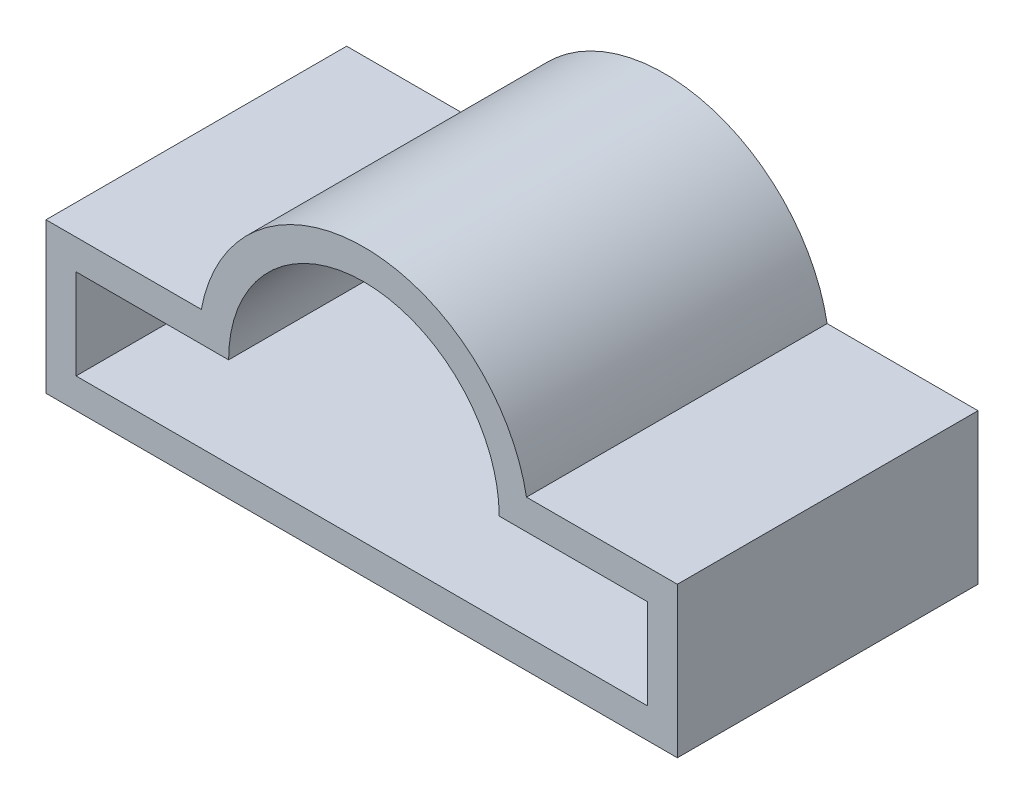
ISO-10303-21;
HEADER;
FILE_DESCRIPTION(('STEP AP214'),'2;1');
FILE_NAME('part.step','',(''),(''),'','','');
FILE_SCHEMA(('AUTOMOTIVE_DESIGN { 1 0 10303 214 1 1 1 1 }'));
ENDSEC;
DATA;
#1=APPLICATION_CONTEXT('core data for automotive mechanical design processes');
#2=APPLICATION_PROTOCOL_DEFINITION('international standard','automotive_design',2000,#1);
#3=PRODUCT_CONTEXT('',#1,'mechanical');
#4=PRODUCT('Part','Part','',(#3));
#5=PRODUCT_RELATED_PRODUCT_CATEGORY('part','',(#4));
#6=PRODUCT_DEFINITION_FORMATION('','',#4);
#7=PRODUCT_DEFINITION_CONTEXT('part definition',#1,'design');
#8=PRODUCT_DEFINITION('design','',#6,#7);
#9=PRODUCT_DEFINITION_SHAPE('','',#8);
#10=(LENGTH_UNIT() NAMED_UNIT(*) SI_UNIT(.MILLI.,.METRE.));
#11=(NAMED_UNIT(*) PLANE_ANGLE_UNIT() SI_UNIT($,.RADIAN.));
#12=(NAMED_UNIT(*) SI_UNIT($,.STERADIAN.) SOLID_ANGLE_UNIT());
#13=UNCERTAINTY_MEASURE_WITH_UNIT(LENGTH_MEASURE(1.E-05),#10,'distance_accuracy_value','');
#14=(GEOMETRIC_REPRESENTATION_CONTEXT(3) GLOBAL_UNCERTAINTY_ASSIGNED_CONTEXT((#13)) GLOBAL_UNIT_ASSIGNED_CONTEXT((#10,
#11,#12)) REPRESENTATION_CONTEXT('',''));
#15=CARTESIAN_POINT('',(0.,0.,0.));
#16=DIRECTION('',(0.,0.,1.));
#17=DIRECTION('',(1.,0.,0.));
#18=AXIS2_PLACEMENT_3D('',#15,#16,#17);
#19=CARTESIAN_POINT('',(0.,0.,10.));
#20=DIRECTION('',(0.,0.,-1.));
#21=DIRECTION('',(-1.,0.,0.));
#22=AXIS2_PLACEMENT_3D('',#19,#20,#21);
#23=PLANE('',#22);
#24=CARTESIAN_POINT('',(0.,0.,10.));
#25=DIRECTION('',(0.,0.,1.));
#26=DIRECTION('',(-1.,0.,0.));
#27=AXIS2_PLACEMENT_3D('',#24,#25,#26);
#28=CIRCLE('',#27,11.);
#29=CARTESIAN_POINT('',(10.816653826392,2.,10.));
#30=VERTEX_POINT('',#29);
#31=CARTESIAN_POINT('',(-10.816653826392,2.,10.));
#32=VERTEX_POINT('',#31);
#33=EDGE_CURVE('E173',#30,#32,#28,.T.);
#34=ORIENTED_EDGE('',*,*,#33,.T.);
#35=DIRECTION('',(-1.,0.,0.));
#36=VECTOR('',#35,1.);
#37=CARTESIAN_POINT('',(-21.1476028804045,2.,10.));
#38=LINE('',#37,#36);
#39=CARTESIAN_POINT('',(-21.1476028804045,2.,10.));
#40=VERTEX_POINT('',#39);
#41=EDGE_CURVE('E176',#32,#40,#38,.T.);
#42=ORIENTED_EDGE('',*,*,#41,.T.);
#43=DIRECTION('',(0.,-1.,0.));
#44=VECTOR('',#43,1.);
#45=CARTESIAN_POINT('',(-21.1476028804045,-8.,10.));
#46=LINE('',#45,#44);
#47=CARTESIAN_POINT('',(-21.1476028804045,-8.,10.));
#48=VERTEX_POINT('',#47);
#49=EDGE_CURVE('E179',#40,#48,#46,.T.);
#50=ORIENTED_EDGE('',*,*,#49,.T.);
#51=DIRECTION('',(1.,0.,0.));
#52=VECTOR('',#51,1.);
#53=CARTESIAN_POINT('',(20.8523971195955,-8.,10.));
#54=LINE('',#53,#52);
#55=CARTESIAN_POINT('',(20.8523971195955,-8.,10.));
#56=VERTEX_POINT('',#55);
#57=EDGE_CURVE('E181',#48,#56,#54,.T.);
#58=ORIENTED_EDGE('',*,*,#57,.T.);
#59=DIRECTION('',(0.,1.,0.));
#60=VECTOR('',#59,1.);
#61=CARTESIAN_POINT('',(20.8523971195955,2.,10.));
#62=LINE('',#61,#60);
#63=CARTESIAN_POINT('',(20.8523971195955,2.,10.));
#64=VERTEX_POINT('',#63);
#65=EDGE_CURVE('E183',#56,#64,#62,.T.);
#66=ORIENTED_EDGE('',*,*,#65,.T.);
#67=DIRECTION('',(-1.,0.,0.));
#68=VECTOR('',#67,1.);
#69=CARTESIAN_POINT('',(10.816653826392,2.,10.));
#70=LINE('',#69,#68);
#71=EDGE_CURVE('E185',#64,#30,#70,.T.);
#72=ORIENTED_EDGE('',*,*,#71,.T.);
#73=EDGE_LOOP('',(#34,#42,#50,#58,#66,#72));
#74=FACE_BOUND('',#73,.T.);
#75=CARTESIAN_POINT('',(0.,0.,10.));
#76=DIRECTION('',(0.,0.,1.));
#77=DIRECTION('',(-1.,0.,0.));
#78=AXIS2_PLACEMENT_3D('',#75,#76,#77);
#79=CIRCLE('',#78,9.);
#80=CARTESIAN_POINT('',(9.,0.,10.));
#81=VERTEX_POINT('',#80);
#82=CARTESIAN_POINT('',(-9.,0.,10.));
#83=VERTEX_POINT('',#82);
#84=EDGE_CURVE('E122',#81,#83,#79,.T.);
#85=ORIENTED_EDGE('',*,*,#84,.F.);
#86=DIRECTION('',(-1.,0.,0.));
#87=VECTOR('',#86,1.);
#88=CARTESIAN_POINT('',(9.,0.,10.));
#89=LINE('',#88,#87);
#90=CARTESIAN_POINT('',(18.8523971195955,0.,10.));
#91=VERTEX_POINT('',#90);
#92=EDGE_CURVE('E151',#91,#81,#89,.T.);
#93=ORIENTED_EDGE('',*,*,#92,.F.);
#94=DIRECTION('',(0.,1.,0.));
#95=VECTOR('',#94,1.);
#96=CARTESIAN_POINT('',(18.8523971195955,0.,10.));
#97=LINE('',#96,#95);
#98=CARTESIAN_POINT('',(18.8523971195955,-6.,10.));
#99=VERTEX_POINT('',#98);
#100=EDGE_CURVE('E149',#99,#91,#97,.T.);
#101=ORIENTED_EDGE('',*,*,#100,.F.);
#102=DIRECTION('',(1.,0.,0.));
#103=VECTOR('',#102,1.);
#104=CARTESIAN_POINT('',(18.8523971195955,-6.,10.));
#105=LINE('',#104,#103);
#106=CARTESIAN_POINT('',(-19.1476028804045,-6.,10.));
#107=VERTEX_POINT('',#106);
#108=EDGE_CURVE('E145',#107,#99,#105,.T.);
#109=ORIENTED_EDGE('',*,*,#108,.F.);
#110=DIRECTION('',(0.,-1.,0.));
#111=VECTOR('',#110,1.);
#112=CARTESIAN_POINT('',(-19.1476028804045,-6.,10.));
#113=LINE('',#112,#111);
#114=CARTESIAN_POINT('',(-19.1476028804045,0.,10.));
#115=VERTEX_POINT('',#114);
#116=EDGE_CURVE('E143',#115,#107,#113,.T.);
#117=ORIENTED_EDGE('',*,*,#116,.F.);
#118=DIRECTION('',(-1.,0.,0.));
#119=VECTOR('',#118,1.);
#120=CARTESIAN_POINT('',(-19.1476028804045,0.,10.));
#121=LINE('',#120,#119);
#122=EDGE_CURVE('E130',#83,#115,#121,.T.);
#123=ORIENTED_EDGE('',*,*,#122,.F.);
#124=EDGE_LOOP('',(#85,#93,#101,#109,#117,#123));
#125=FACE_BOUND('',#124,.T.);
#126=ADVANCED_FACE('F33',(#74,#125),#23,.F.);
#127=CARTESIAN_POINT('',(0.,0.,-10.));
#128=DIRECTION('',(0.,0.,-1.));
#129=DIRECTION('',(-1.,0.,0.));
#130=AXIS2_PLACEMENT_3D('',#127,#128,#129);
#131=PLANE('',#130);
#132=CARTESIAN_POINT('',(0.,0.,-10.));
#133=DIRECTION('',(0.,0.,1.));
#134=DIRECTION('',(-1.,0.,0.));
#135=AXIS2_PLACEMENT_3D('',#132,#133,#134);
#136=CIRCLE('',#135,11.);
#137=CARTESIAN_POINT('',(10.816653826392,2.,-10.));
#138=VERTEX_POINT('',#137);
#139=CARTESIAN_POINT('',(-10.816653826392,2.,-10.));
#140=VERTEX_POINT('',#139);
#141=EDGE_CURVE('E138',#138,#140,#136,.T.);
#142=ORIENTED_EDGE('',*,*,#141,.F.);
#143=DIRECTION('',(-1.,0.,0.));
#144=VECTOR('',#143,1.);
#145=CARTESIAN_POINT('',(10.816653826392,2.,-10.));
#146=LINE('',#145,#144);
#147=CARTESIAN_POINT('',(20.8523971195955,2.,-10.));
#148=VERTEX_POINT('',#147);
#149=EDGE_CURVE('E177',#148,#138,#146,.T.);
#150=ORIENTED_EDGE('',*,*,#149,.F.);
#151=DIRECTION('',(0.,1.,0.));
#152=VECTOR('',#151,1.);
#153=CARTESIAN_POINT('',(20.8523971195955,2.,-10.));
#154=LINE('',#153,#152);
#155=CARTESIAN_POINT('',(20.8523971195955,-8.,-10.));
#156=VERTEX_POINT('',#155);
#157=EDGE_CURVE('E196',#156,#148,#154,.T.);
#158=ORIENTED_EDGE('',*,*,#157,.F.);
#159=DIRECTION('',(1.,0.,0.));
#160=VECTOR('',#159,1.);
#161=CARTESIAN_POINT('',(20.8523971195955,-8.,-10.));
#162=LINE('',#161,#160);
#163=CARTESIAN_POINT('',(-21.1476028804045,-8.,-10.));
#164=VERTEX_POINT('',#163);
#165=EDGE_CURVE('E194',#164,#156,#162,.T.);
#166=ORIENTED_EDGE('',*,*,#165,.F.);
#167=DIRECTION('',(0.,-1.,0.));
#168=VECTOR('',#167,1.);
#169=CARTESIAN_POINT('',(-21.1476028804045,-8.,-10.));
#170=LINE('',#169,#168);
#171=CARTESIAN_POINT('',(-21.1476028804045,2.,-10.));
#172=VERTEX_POINT('',#171);
#173=EDGE_CURVE('E192',#172,#164,#170,.T.);
#174=ORIENTED_EDGE('',*,*,#173,.F.);
#175=DIRECTION('',(-1.,0.,0.));
#176=VECTOR('',#175,1.);
#177=CARTESIAN_POINT('',(-21.1476028804045,2.,-10.));
#178=LINE('',#177,#176);
#179=EDGE_CURVE('E190',#140,#172,#178,.T.);
#180=ORIENTED_EDGE('',*,*,#179,.F.);
#181=EDGE_LOOP('',(#142,#150,#158,#166,#174,#180));
#182=FACE_BOUND('',#181,.T.);
#183=DIRECTION('',(-1.,0.,0.));
#184=VECTOR('',#183,1.);
#185=CARTESIAN_POINT('',(9.,0.,-10.));
#186=LINE('',#185,#184);
#187=CARTESIAN_POINT('',(18.8523971195955,0.,-10.));
#188=VERTEX_POINT('',#187);
#189=CARTESIAN_POINT('',(9.,0.,-10.));
#190=VERTEX_POINT('',#189);
#191=EDGE_CURVE('E131',#188,#190,#186,.T.);
#192=ORIENTED_EDGE('',*,*,#191,.T.);
#193=CARTESIAN_POINT('',(0.,0.,-10.));
#194=DIRECTION('',(0.,0.,1.));
#195=DIRECTION('',(-1.,0.,0.));
#196=AXIS2_PLACEMENT_3D('',#193,#194,#195);
#197=CIRCLE('',#196,9.);
#198=CARTESIAN_POINT('',(-9.,0.,-10.));
#199=VERTEX_POINT('',#198);
#200=EDGE_CURVE('E56',#190,#199,#197,.T.);
#201=ORIENTED_EDGE('',*,*,#200,.T.);
#202=DIRECTION('',(-1.,0.,0.));
#203=VECTOR('',#202,1.);
#204=CARTESIAN_POINT('',(-19.1476028804045,0.,-10.));
#205=LINE('',#204,#203);
#206=CARTESIAN_POINT('',(-19.1476028804045,0.,-10.));
#207=VERTEX_POINT('',#206);
#208=EDGE_CURVE('E137',#199,#207,#205,.T.);
#209=ORIENTED_EDGE('',*,*,#208,.T.);
#210=DIRECTION('',(0.,-1.,0.));
#211=VECTOR('',#210,1.);
#212=CARTESIAN_POINT('',(-19.1476028804045,-6.,-10.));
#213=LINE('',#212,#211);
#214=CARTESIAN_POINT('',(-19.1476028804045,-6.,-10.));
#215=VERTEX_POINT('',#214);
#216=EDGE_CURVE('E155',#207,#215,#213,.T.);
#217=ORIENTED_EDGE('',*,*,#216,.T.);
#218=DIRECTION('',(1.,0.,0.));
#219=VECTOR('',#218,1.);
#220=CARTESIAN_POINT('',(18.8523971195955,-6.,-10.));
#221=LINE('',#220,#219);
#222=CARTESIAN_POINT('',(18.8523971195955,-6.,-10.));
#223=VERTEX_POINT('',#222);
#224=EDGE_CURVE('E158',#215,#223,#221,.T.);
#225=ORIENTED_EDGE('',*,*,#224,.T.);
#226=DIRECTION('',(0.,1.,0.));
#227=VECTOR('',#226,1.);
#228=CARTESIAN_POINT('',(18.8523971195955,0.,-10.));
#229=LINE('',#228,#227);
#230=EDGE_CURVE('E161',#223,#188,#229,.T.);
#231=ORIENTED_EDGE('',*,*,#230,.T.);
#232=EDGE_LOOP('',(#192,#201,#209,#217,#225,#231));
#233=FACE_BOUND('',#232,.T.);
#234=ADVANCED_FACE('F220',(#182,#233),#131,.T.);
#235=CARTESIAN_POINT('',(0.,0.,10.));
#236=DIRECTION('',(0.,0.,-1.));
#237=DIRECTION('',(-1.,0.,0.));
#238=AXIS2_PLACEMENT_3D('',#235,#236,#237);
#239=CYLINDRICAL_SURFACE('',#238,11.);
#240=ORIENTED_EDGE('',*,*,#141,.T.);
#241=DIRECTION('',(0.,0.,-1.));
#242=VECTOR('',#241,1.);
#243=CARTESIAN_POINT('',(-10.816653826392,2.,10.));
#244=LINE('',#243,#242);
#245=EDGE_CURVE('E11',#32,#140,#244,.T.);
#246=ORIENTED_EDGE('',*,*,#245,.F.);
#247=ORIENTED_EDGE('',*,*,#33,.F.);
#248=DIRECTION('',(0.,0.,-1.));
#249=VECTOR('',#248,1.);
#250=CARTESIAN_POINT('',(10.816653826392,2.,10.));
#251=LINE('',#250,#249);
#252=EDGE_CURVE('E187',#30,#138,#251,.T.);
#253=ORIENTED_EDGE('',*,*,#252,.T.);
#254=EDGE_LOOP('',(#240,#246,#247,#253));
#255=FACE_BOUND('',#254,.T.);
#256=ADVANCED_FACE('F35',(#255),#239,.T.);
#257=CARTESIAN_POINT('',(-21.1476028804045,2.,10.));
#258=DIRECTION('',(0.,-1.,0.));
#259=DIRECTION('',(1.,0.,0.));
#260=AXIS2_PLACEMENT_3D('',#257,#258,#259);
#261=PLANE('',#260);
#262=ORIENTED_EDGE('',*,*,#179,.T.);
#263=DIRECTION('',(0.,0.,-1.));
#264=VECTOR('',#263,1.);
#265=CARTESIAN_POINT('',(-21.1476028804045,2.,10.));
#266=LINE('',#265,#264);
#267=EDGE_CURVE('E41',#40,#172,#266,.T.);
#268=ORIENTED_EDGE('',*,*,#267,.F.);
#269=ORIENTED_EDGE('',*,*,#41,.F.);
#270=ORIENTED_EDGE('',*,*,#245,.T.);
#271=EDGE_LOOP('',(#262,#268,#269,#270));
#272=FACE_BOUND('',#271,.T.);
#273=ADVANCED_FACE('F237',(#272),#261,.F.);
#274=CARTESIAN_POINT('',(-21.1476028804045,-8.,10.));
#275=DIRECTION('',(1.,0.,0.));
#276=DIRECTION('',(0.,0.,-1.));
#277=AXIS2_PLACEMENT_3D('',#274,#275,#276);
#278=PLANE('',#277);
#279=ORIENTED_EDGE('',*,*,#173,.T.);
#280=DIRECTION('',(0.,0.,-1.));
#281=VECTOR('',#280,1.);
#282=CARTESIAN_POINT('',(-21.1476028804045,-8.,10.));
#283=LINE('',#282,#281);
#284=EDGE_CURVE('E207',#48,#164,#283,.T.);
#285=ORIENTED_EDGE('',*,*,#284,.F.);
#286=ORIENTED_EDGE('',*,*,#49,.F.);
#287=ORIENTED_EDGE('',*,*,#267,.T.);
#288=EDGE_LOOP('',(#279,#285,#286,#287));
#289=FACE_BOUND('',#288,.T.);
#290=ADVANCED_FACE('F214',(#289),#278,.F.);
#291=CARTESIAN_POINT('',(20.8523971195955,-8.,10.));
#292=DIRECTION('',(0.,1.,0.));
#293=DIRECTION('',(-1.,0.,0.));
#294=AXIS2_PLACEMENT_3D('',#291,#292,#293);
#295=PLANE('',#294);
#296=ORIENTED_EDGE('',*,*,#165,.T.);
#297=DIRECTION('',(0.,0.,-1.));
#298=VECTOR('',#297,1.);
#299=CARTESIAN_POINT('',(20.8523971195955,-8.,10.));
#300=LINE('',#299,#298);
#301=EDGE_CURVE('E204',#56,#156,#300,.T.);
#302=ORIENTED_EDGE('',*,*,#301,.F.);
#303=ORIENTED_EDGE('',*,*,#57,.F.);
#304=ORIENTED_EDGE('',*,*,#284,.T.);
#305=EDGE_LOOP('',(#296,#302,#303,#304));
#306=FACE_BOUND('',#305,.T.);
#307=ADVANCED_FACE('F226',(#306),#295,.F.);
#308=CARTESIAN_POINT('',(20.8523971195955,2.,10.));
#309=DIRECTION('',(-1.,0.,0.));
#310=DIRECTION('',(0.,-1.,0.));
#311=AXIS2_PLACEMENT_3D('',#308,#309,#310);
#312=PLANE('',#311);
#313=ORIENTED_EDGE('',*,*,#157,.T.);
#314=DIRECTION('',(0.,0.,-1.));
#315=VECTOR('',#314,1.);
#316=CARTESIAN_POINT('',(20.8523971195955,2.,10.));
#317=LINE('',#316,#315);
#318=EDGE_CURVE('E201',#64,#148,#317,.T.);
#319=ORIENTED_EDGE('',*,*,#318,.F.);
#320=ORIENTED_EDGE('',*,*,#65,.F.);
#321=ORIENTED_EDGE('',*,*,#301,.T.);
#322=EDGE_LOOP('',(#313,#319,#320,#321));
#323=FACE_BOUND('',#322,.T.);
#324=ADVANCED_FACE('F230',(#323),#312,.F.);
#325=CARTESIAN_POINT('',(10.816653826392,2.,10.));
#326=DIRECTION('',(0.,-1.,0.));
#327=DIRECTION('',(1.,0.,0.));
#328=AXIS2_PLACEMENT_3D('',#325,#326,#327);
#329=PLANE('',#328);
#330=ORIENTED_EDGE('',*,*,#149,.T.);
#331=ORIENTED_EDGE('',*,*,#252,.F.);
#332=ORIENTED_EDGE('',*,*,#71,.F.);
#333=ORIENTED_EDGE('',*,*,#318,.T.);
#334=EDGE_LOOP('',(#330,#331,#332,#333));
#335=FACE_BOUND('',#334,.T.);
#336=ADVANCED_FACE('F240',(#335),#329,.F.);
#337=CARTESIAN_POINT('',(0.,0.,10.));
#338=DIRECTION('',(0.,0.,-1.));
#339=DIRECTION('',(-1.,0.,0.));
#340=AXIS2_PLACEMENT_3D('',#337,#338,#339);
#341=CYLINDRICAL_SURFACE('',#340,9.);
#342=ORIENTED_EDGE('',*,*,#200,.F.);
#343=DIRECTION('',(0.,0.,-1.));
#344=VECTOR('',#343,1.);
#345=CARTESIAN_POINT('',(9.,0.,10.));
#346=LINE('',#345,#344);
#347=EDGE_CURVE('E126',#81,#190,#346,.T.);
#348=ORIENTED_EDGE('',*,*,#347,.F.);
#349=ORIENTED_EDGE('',*,*,#84,.T.);
#350=DIRECTION('',(0.,0.,-1.));
#351=VECTOR('',#350,1.);
#352=CARTESIAN_POINT('',(-9.,0.,10.));
#353=LINE('',#352,#351);
#354=EDGE_CURVE('E125',#83,#199,#353,.T.);
#355=ORIENTED_EDGE('',*,*,#354,.T.);
#356=EDGE_LOOP('',(#342,#348,#349,#355));
#357=FACE_BOUND('',#356,.T.);
#358=ADVANCED_FACE('F124',(#357),#341,.F.);
#359=CARTESIAN_POINT('',(-19.1476028804045,0.,10.));
#360=DIRECTION('',(0.,-1.,0.));
#361=DIRECTION('',(1.,0.,0.));
#362=AXIS2_PLACEMENT_3D('',#359,#360,#361);
#363=PLANE('',#362);
#364=ORIENTED_EDGE('',*,*,#208,.F.);
#365=ORIENTED_EDGE('',*,*,#354,.F.);
#366=ORIENTED_EDGE('',*,*,#122,.T.);
#367=DIRECTION('',(0.,0.,-1.));
#368=VECTOR('',#367,1.);
#369=CARTESIAN_POINT('',(-19.1476028804045,0.,10.));
#370=LINE('',#369,#368);
#371=EDGE_CURVE('E139',#115,#207,#370,.T.);
#372=ORIENTED_EDGE('',*,*,#371,.T.);
#373=EDGE_LOOP('',(#364,#365,#366,#372));
#374=FACE_BOUND('',#373,.T.);
#375=ADVANCED_FACE('F134',(#374),#363,.T.);
#376=CARTESIAN_POINT('',(-19.1476028804045,-6.,10.));
#377=DIRECTION('',(1.,0.,0.));
#378=DIRECTION('',(0.,1.,0.));
#379=AXIS2_PLACEMENT_3D('',#376,#377,#378);
#380=PLANE('',#379);
#381=ORIENTED_EDGE('',*,*,#216,.F.);
#382=ORIENTED_EDGE('',*,*,#371,.F.);
#383=ORIENTED_EDGE('',*,*,#116,.T.);
#384=DIRECTION('',(0.,0.,-1.));
#385=VECTOR('',#384,1.);
#386=CARTESIAN_POINT('',(-19.1476028804045,-6.,10.));
#387=LINE('',#386,#385);
#388=EDGE_CURVE('E170',#107,#215,#387,.T.);
#389=ORIENTED_EDGE('',*,*,#388,.T.);
#390=EDGE_LOOP('',(#381,#382,#383,#389));
#391=FACE_BOUND('',#390,.T.);
#392=ADVANCED_FACE('F258',(#391),#380,.T.);
#393=CARTESIAN_POINT('',(18.8523971195955,-6.,10.));
#394=DIRECTION('',(0.,1.,0.));
#395=DIRECTION('',(-1.,0.,0.));
#396=AXIS2_PLACEMENT_3D('',#393,#394,#395);
#397=PLANE('',#396);
#398=ORIENTED_EDGE('',*,*,#224,.F.);
#399=ORIENTED_EDGE('',*,*,#388,.F.);
#400=ORIENTED_EDGE('',*,*,#108,.T.);
#401=DIRECTION('',(0.,0.,-1.));
#402=VECTOR('',#401,1.);
#403=CARTESIAN_POINT('',(18.8523971195955,-6.,10.));
#404=LINE('',#403,#402);
#405=EDGE_CURVE('E168',#99,#223,#404,.T.);
#406=ORIENTED_EDGE('',*,*,#405,.T.);
#407=EDGE_LOOP('',(#398,#399,#400,#406));
#408=FACE_BOUND('',#407,.T.);
#409=ADVANCED_FACE('F261',(#408),#397,.T.);
#410=CARTESIAN_POINT('',(18.8523971195955,0.,10.));
#411=DIRECTION('',(-1.,0.,0.));
#412=DIRECTION('',(0.,-1.,0.));
#413=AXIS2_PLACEMENT_3D('',#410,#411,#412);
#414=PLANE('',#413);
#415=ORIENTED_EDGE('',*,*,#230,.F.);
#416=ORIENTED_EDGE('',*,*,#405,.F.);
#417=ORIENTED_EDGE('',*,*,#100,.T.);
#418=DIRECTION('',(0.,0.,-1.));
#419=VECTOR('',#418,1.);
#420=CARTESIAN_POINT('',(18.8523971195955,0.,10.));
#421=LINE('',#420,#419);
#422=EDGE_CURVE('E48',#91,#188,#421,.T.);
#423=ORIENTED_EDGE('',*,*,#422,.T.);
#424=EDGE_LOOP('',(#415,#416,#417,#423));
#425=FACE_BOUND('',#424,.T.);
#426=ADVANCED_FACE('F265',(#425),#414,.T.);
#427=CARTESIAN_POINT('',(9.,0.,10.));
#428=DIRECTION('',(0.,-1.,0.));
#429=DIRECTION('',(1.,0.,0.));
#430=AXIS2_PLACEMENT_3D('',#427,#428,#429);
#431=PLANE('',#430);
#432=ORIENTED_EDGE('',*,*,#191,.F.);
#433=ORIENTED_EDGE('',*,*,#422,.F.);
#434=ORIENTED_EDGE('',*,*,#92,.T.);
#435=ORIENTED_EDGE('',*,*,#347,.T.);
#436=EDGE_LOOP('',(#432,#433,#434,#435));
#437=FACE_BOUND('',#436,.T.);
#438=ADVANCED_FACE('F269',(#437),#431,.T.);
#439=CLOSED_SHELL('',(#126,#234,#256,#273,#290,#307,#324,#336,#358,#375,#392,#409,#426,#438));
#440=MANIFOLD_SOLID_BREP('B2',#439);
#441=ADVANCED_BREP_SHAPE_REPRESENTATION('',(#18,#440),#14);
#442=SHAPE_DEFINITION_REPRESENTATION(#9,#441);
ENDSEC;
END-ISO-10303-21;
